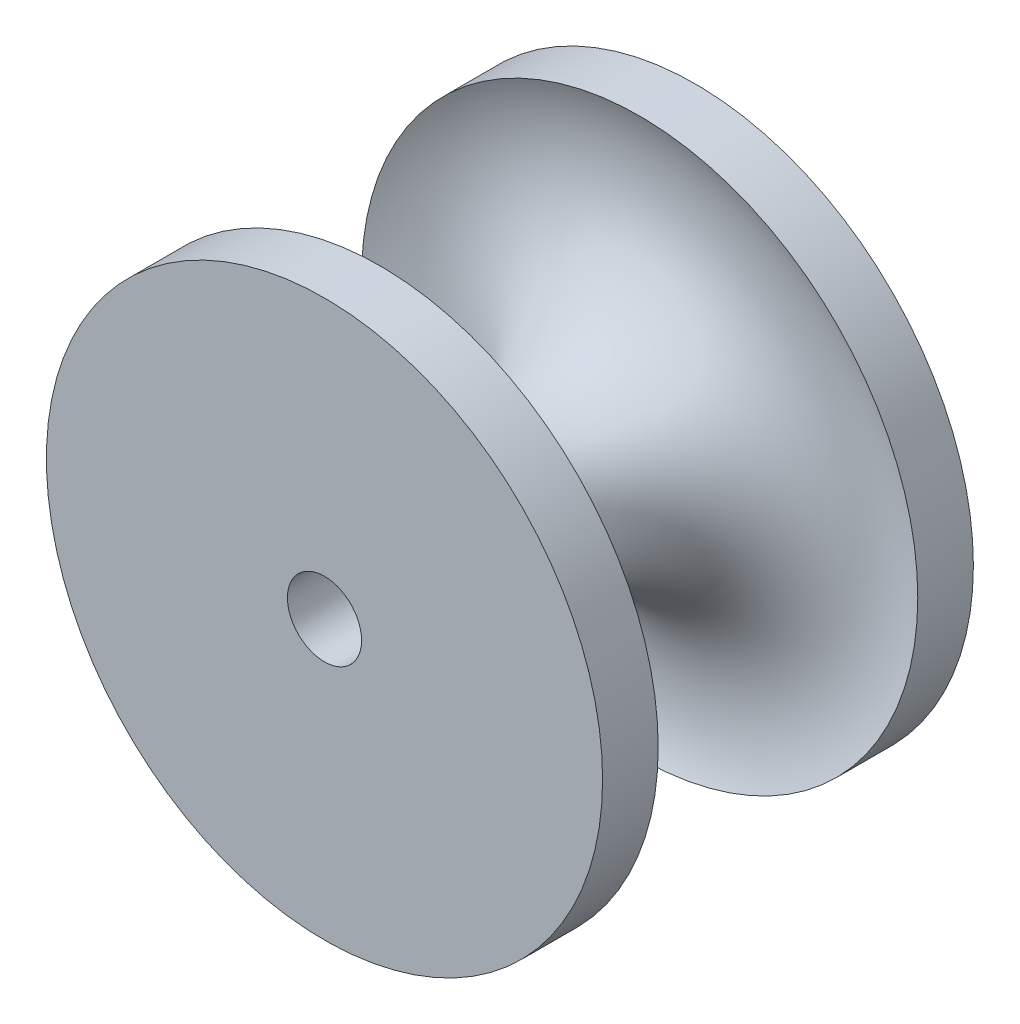
ISO-10303-21;
HEADER;
FILE_DESCRIPTION(('STEP AP214'),'2;1');
FILE_NAME('part.step','',(''),(''),'','','');
FILE_SCHEMA(('AUTOMOTIVE_DESIGN { 1 0 10303 214 1 1 1 1 }'));
ENDSEC;
DATA;
#1=APPLICATION_CONTEXT('core data for automotive mechanical design processes');
#2=APPLICATION_PROTOCOL_DEFINITION('international standard','automotive_design',2000,#1);
#3=PRODUCT_CONTEXT('',#1,'mechanical');
#4=PRODUCT('Part','Part','',(#3));
#5=PRODUCT_RELATED_PRODUCT_CATEGORY('part','',(#4));
#6=PRODUCT_DEFINITION_FORMATION('','',#4);
#7=PRODUCT_DEFINITION_CONTEXT('part definition',#1,'design');
#8=PRODUCT_DEFINITION('design','',#6,#7);
#9=PRODUCT_DEFINITION_SHAPE('','',#8);
#10=(LENGTH_UNIT() NAMED_UNIT(*) SI_UNIT(.MILLI.,.METRE.));
#11=(NAMED_UNIT(*) PLANE_ANGLE_UNIT() SI_UNIT($,.RADIAN.));
#12=(NAMED_UNIT(*) SI_UNIT($,.STERADIAN.) SOLID_ANGLE_UNIT());
#13=UNCERTAINTY_MEASURE_WITH_UNIT(LENGTH_MEASURE(1.E-05),#10,'distance_accuracy_value','');
#14=(GEOMETRIC_REPRESENTATION_CONTEXT(3) GLOBAL_UNCERTAINTY_ASSIGNED_CONTEXT((#13)) GLOBAL_UNIT_ASSIGNED_CONTEXT((#10,
#11,#12)) REPRESENTATION_CONTEXT('',''));
#15=CARTESIAN_POINT('',(0.,0.,0.));
#16=DIRECTION('',(0.,0.,1.));
#17=DIRECTION('',(1.,0.,0.));
#18=AXIS2_PLACEMENT_3D('',#15,#16,#17);
#19=CARTESIAN_POINT('',(0.,0.,25.4));
#20=DIRECTION('',(0.,0.,-1.));
#21=DIRECTION('',(-1.,0.,0.));
#22=AXIS2_PLACEMENT_3D('',#19,#20,#21);
#23=CYLINDRICAL_SURFACE('',#22,19.05);
#24=CARTESIAN_POINT('',(0.,0.,25.4));
#25=DIRECTION('',(0.,0.,1.));
#26=DIRECTION('',(1.,0.,0.));
#27=AXIS2_PLACEMENT_3D('',#24,#25,#26);
#28=CIRCLE('',#27,19.05);
#29=CARTESIAN_POINT('',(19.05,0.,25.4));
#30=VERTEX_POINT('',#29);
#31=EDGE_CURVE('E10',#30,#30,#28,.T.);
#32=ORIENTED_EDGE('',*,*,#31,.F.);
#33=EDGE_LOOP('',(#32));
#34=FACE_BOUND('',#33,.T.);
#35=CARTESIAN_POINT('',(0.,0.,21.59));
#36=DIRECTION('',(0.,0.,1.));
#37=DIRECTION('',(1.,0.,0.));
#38=AXIS2_PLACEMENT_3D('',#35,#36,#37);
#39=CIRCLE('',#38,19.05);
#40=CARTESIAN_POINT('',(19.05,0.,21.59));
#41=VERTEX_POINT('',#40);
#42=EDGE_CURVE('E50',#41,#41,#39,.T.);
#43=ORIENTED_EDGE('',*,*,#42,.T.);
#44=EDGE_LOOP('',(#43));
#45=FACE_BOUND('',#44,.T.);
#46=ADVANCED_FACE('F34',(#34,#45),#23,.T.);
#47=CARTESIAN_POINT('',(0.,0.,25.4));
#48=DIRECTION('',(0.,0.,1.));
#49=DIRECTION('',(1.,0.,0.));
#50=AXIS2_PLACEMENT_3D('',#47,#48,#49);
#51=PLANE('',#50);
#52=CARTESIAN_POINT('',(0.,0.,25.4));
#53=DIRECTION('',(0.,0.,1.));
#54=DIRECTION('',(1.,0.,0.));
#55=AXIS2_PLACEMENT_3D('',#52,#53,#54);
#56=CIRCLE('',#55,2.54);
#57=CARTESIAN_POINT('',(2.54,0.,25.4));
#58=VERTEX_POINT('',#57);
#59=EDGE_CURVE('E53',#58,#58,#56,.T.);
#60=ORIENTED_EDGE('',*,*,#59,.F.);
#61=EDGE_LOOP('',(#60));
#62=FACE_BOUND('',#61,.T.);
#63=ORIENTED_EDGE('',*,*,#31,.T.);
#64=EDGE_LOOP('',(#63));
#65=FACE_BOUND('',#64,.T.);
#66=ADVANCED_FACE('F73',(#62,#65),#51,.T.);
#67=CARTESIAN_POINT('',(0.,0.,12.7));
#68=DIRECTION('',(0.,0.,1.));
#69=DIRECTION('',(1.,0.,0.));
#70=AXIS2_PLACEMENT_3D('',#67,#68,#69);
#71=TOROIDAL_SURFACE('',#70,14.9294398990431,9.79852619252496);
#72=CARTESIAN_POINT('',(0.,0.,3.81));
#73=DIRECTION('',(0.,0.,1.));
#74=DIRECTION('',(1.,0.,0.));
#75=AXIS2_PLACEMENT_3D('',#72,#73,#74);
#76=CIRCLE('',#75,19.05);
#77=CARTESIAN_POINT('',(19.05,0.,3.81));
#78=VERTEX_POINT('',#77);
#79=EDGE_CURVE('E46',#78,#78,#76,.T.);
#80=ORIENTED_EDGE('',*,*,#79,.T.);
#81=EDGE_LOOP('',(#80));
#82=FACE_BOUND('',#81,.T.);
#83=ORIENTED_EDGE('',*,*,#42,.F.);
#84=EDGE_LOOP('',(#83));
#85=FACE_BOUND('',#84,.T.);
#86=ADVANCED_FACE('F78',(#82,#85),#71,.F.);
#87=CARTESIAN_POINT('',(0.,0.,0.));
#88=DIRECTION('',(0.,0.,1.));
#89=DIRECTION('',(1.,0.,0.));
#90=AXIS2_PLACEMENT_3D('',#87,#88,#89);
#91=PLANE('',#90);
#92=CARTESIAN_POINT('',(0.,0.,0.));
#93=DIRECTION('',(0.,0.,1.));
#94=DIRECTION('',(1.,0.,0.));
#95=AXIS2_PLACEMENT_3D('',#92,#93,#94);
#96=CIRCLE('',#95,2.54);
#97=CARTESIAN_POINT('',(2.54,0.,0.));
#98=VERTEX_POINT('',#97);
#99=EDGE_CURVE('E37',#98,#98,#96,.T.);
#100=ORIENTED_EDGE('',*,*,#99,.T.);
#101=EDGE_LOOP('',(#100));
#102=FACE_BOUND('',#101,.T.);
#103=CARTESIAN_POINT('',(0.,0.,0.));
#104=DIRECTION('',(0.,0.,1.));
#105=DIRECTION('',(1.,0.,0.));
#106=AXIS2_PLACEMENT_3D('',#103,#104,#105);
#107=CIRCLE('',#106,19.05);
#108=CARTESIAN_POINT('',(19.05,0.,0.));
#109=VERTEX_POINT('',#108);
#110=EDGE_CURVE('E41',#109,#109,#107,.T.);
#111=ORIENTED_EDGE('',*,*,#110,.F.);
#112=EDGE_LOOP('',(#111));
#113=FACE_BOUND('',#112,.T.);
#114=ADVANCED_FACE('F60',(#102,#113),#91,.F.);
#115=ORIENTED_EDGE('',*,*,#110,.T.);
#116=EDGE_LOOP('',(#115));
#117=FACE_BOUND('',#116,.T.);
#118=ORIENTED_EDGE('',*,*,#79,.F.);
#119=EDGE_LOOP('',(#118));
#120=FACE_BOUND('',#119,.T.);
#121=ADVANCED_FACE('F65',(#117,#120),#23,.T.);
#122=CARTESIAN_POINT('',(0.,0.,-7.366));
#123=DIRECTION('',(0.,0.,1.));
#124=DIRECTION('',(1.,0.,0.));
#125=AXIS2_PLACEMENT_3D('',#122,#123,#124);
#126=CYLINDRICAL_SURFACE('',#125,2.54);
#127=ORIENTED_EDGE('',*,*,#59,.T.);
#128=EDGE_LOOP('',(#127));
#129=FACE_BOUND('',#128,.T.);
#130=ORIENTED_EDGE('',*,*,#99,.F.);
#131=EDGE_LOOP('',(#130));
#132=FACE_BOUND('',#131,.T.);
#133=ADVANCED_FACE('F63',(#129,#132),#126,.F.);
#134=CLOSED_SHELL('',(#46,#66,#86,#114,#121,#133));
#135=MANIFOLD_SOLID_BREP('B2',#134);
#136=ADVANCED_BREP_SHAPE_REPRESENTATION('',(#18,#135),#14);
#137=SHAPE_DEFINITION_REPRESENTATION(#9,#136);
ENDSEC;
END-ISO-10303-21;
